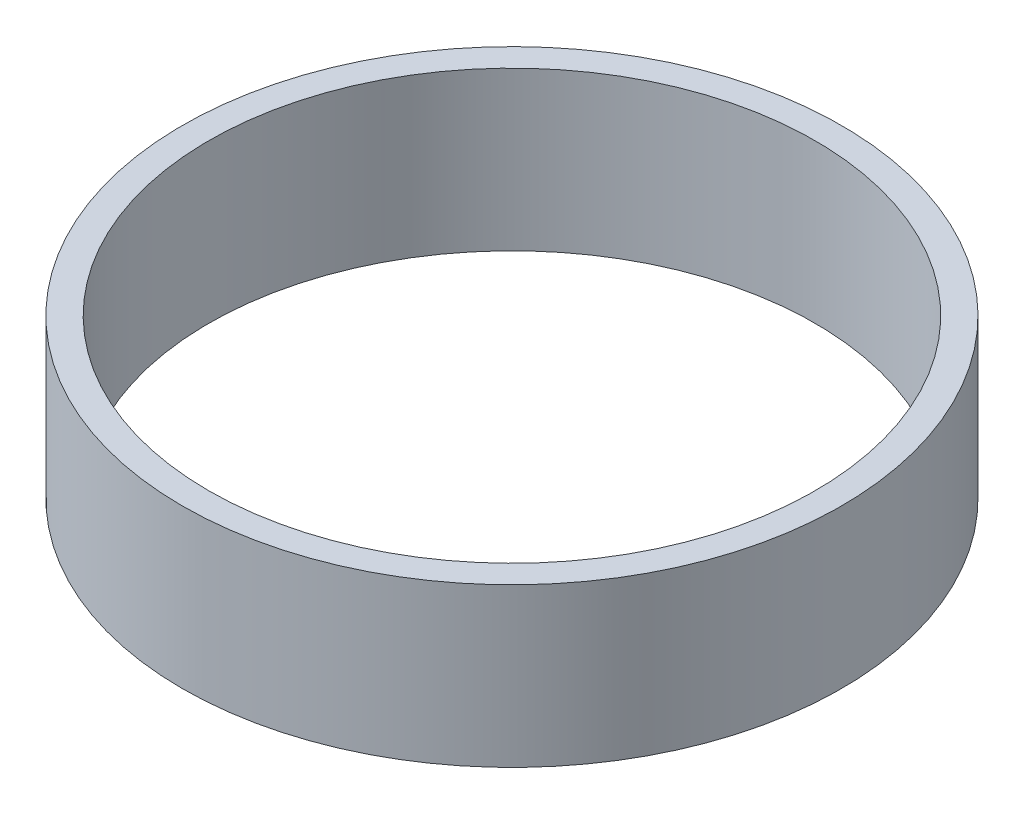
ISO-10303-21;
HEADER;
FILE_DESCRIPTION(('STEP AP214'),'2;1');
FILE_NAME('part.step','',(''),(''),'','','');
FILE_SCHEMA(('AUTOMOTIVE_DESIGN { 1 0 10303 214 1 1 1 1 }'));
ENDSEC;
DATA;
#1=APPLICATION_CONTEXT('core data for automotive mechanical design processes');
#2=APPLICATION_PROTOCOL_DEFINITION('international standard','automotive_design',2000,#1);
#3=PRODUCT_CONTEXT('',#1,'mechanical');
#4=PRODUCT('Part','Part','',(#3));
#5=PRODUCT_RELATED_PRODUCT_CATEGORY('part','',(#4));
#6=PRODUCT_DEFINITION_FORMATION('','',#4);
#7=PRODUCT_DEFINITION_CONTEXT('part definition',#1,'design');
#8=PRODUCT_DEFINITION('design','',#6,#7);
#9=PRODUCT_DEFINITION_SHAPE('','',#8);
#10=(LENGTH_UNIT() NAMED_UNIT(*) SI_UNIT(.MILLI.,.METRE.));
#11=(NAMED_UNIT(*) PLANE_ANGLE_UNIT() SI_UNIT($,.RADIAN.));
#12=(NAMED_UNIT(*) SI_UNIT($,.STERADIAN.) SOLID_ANGLE_UNIT());
#13=UNCERTAINTY_MEASURE_WITH_UNIT(LENGTH_MEASURE(1.E-05),#10,'distance_accuracy_value','');
#14=(GEOMETRIC_REPRESENTATION_CONTEXT(3) GLOBAL_UNCERTAINTY_ASSIGNED_CONTEXT((#13)) GLOBAL_UNIT_ASSIGNED_CONTEXT((#10,
#11,#12)) REPRESENTATION_CONTEXT('',''));
#15=CARTESIAN_POINT('',(0.,0.,0.));
#16=DIRECTION('',(0.,0.,1.));
#17=DIRECTION('',(1.,0.,0.));
#18=AXIS2_PLACEMENT_3D('',#15,#16,#17);
#19=CARTESIAN_POINT('',(0.,3.,0.));
#20=DIRECTION('',(0.,1.,0.));
#21=DIRECTION('',(0.,0.,1.));
#22=AXIS2_PLACEMENT_3D('',#19,#20,#21);
#23=PLANE('',#22);
#24=CARTESIAN_POINT('',(0.,3.,0.));
#25=DIRECTION('',(0.,1.,0.));
#26=DIRECTION('',(0.,0.,1.));
#27=AXIS2_PLACEMENT_3D('',#24,#25,#26);
#28=CIRCLE('',#27,6.25);
#29=CARTESIAN_POINT('',(0.,3.,6.25));
#30=VERTEX_POINT('',#29);
#31=EDGE_CURVE('E10',#30,#30,#28,.T.);
#32=ORIENTED_EDGE('',*,*,#31,.T.);
#33=EDGE_LOOP('',(#32));
#34=FACE_BOUND('',#33,.T.);
#35=CARTESIAN_POINT('',(0.,3.,0.));
#36=DIRECTION('',(0.,1.,0.));
#37=DIRECTION('',(0.,0.,1.));
#38=AXIS2_PLACEMENT_3D('',#35,#36,#37);
#39=CIRCLE('',#38,5.75);
#40=CARTESIAN_POINT('',(0.,3.,5.75));
#41=VERTEX_POINT('',#40);
#42=EDGE_CURVE('E52',#41,#41,#39,.T.);
#43=ORIENTED_EDGE('',*,*,#42,.F.);
#44=EDGE_LOOP('',(#43));
#45=FACE_BOUND('',#44,.T.);
#46=ADVANCED_FACE('F39',(#34,#45),#23,.T.);
#47=CARTESIAN_POINT('',(0.,0.,0.));
#48=DIRECTION('',(0.,1.,0.));
#49=DIRECTION('',(0.,0.,1.));
#50=AXIS2_PLACEMENT_3D('',#47,#48,#49);
#51=PLANE('',#50);
#52=CARTESIAN_POINT('',(0.,0.,0.));
#53=DIRECTION('',(0.,1.,0.));
#54=DIRECTION('',(0.,0.,1.));
#55=AXIS2_PLACEMENT_3D('',#52,#53,#54);
#56=CIRCLE('',#55,6.25);
#57=CARTESIAN_POINT('',(0.,0.,6.25));
#58=VERTEX_POINT('',#57);
#59=EDGE_CURVE('E43',#58,#58,#56,.T.);
#60=ORIENTED_EDGE('',*,*,#59,.F.);
#61=EDGE_LOOP('',(#60));
#62=FACE_BOUND('',#61,.T.);
#63=CARTESIAN_POINT('',(0.,0.,0.));
#64=DIRECTION('',(0.,1.,0.));
#65=DIRECTION('',(0.,0.,1.));
#66=AXIS2_PLACEMENT_3D('',#63,#64,#65);
#67=CIRCLE('',#66,5.75);
#68=CARTESIAN_POINT('',(0.,0.,5.75));
#69=VERTEX_POINT('',#68);
#70=EDGE_CURVE('E54',#69,#69,#67,.T.);
#71=ORIENTED_EDGE('',*,*,#70,.T.);
#72=EDGE_LOOP('',(#71));
#73=FACE_BOUND('',#72,.T.);
#74=ADVANCED_FACE('F66',(#62,#73),#51,.F.);
#75=CARTESIAN_POINT('',(0.,3.,0.));
#76=DIRECTION('',(0.,-1.,0.));
#77=DIRECTION('',(0.,0.,-1.));
#78=AXIS2_PLACEMENT_3D('',#75,#76,#77);
#79=CYLINDRICAL_SURFACE('',#78,6.25);
#80=ORIENTED_EDGE('',*,*,#31,.F.);
#81=EDGE_LOOP('',(#80));
#82=FACE_BOUND('',#81,.T.);
#83=ORIENTED_EDGE('',*,*,#59,.T.);
#84=EDGE_LOOP('',(#83));
#85=FACE_BOUND('',#84,.T.);
#86=ADVANCED_FACE('F41',(#82,#85),#79,.T.);
#87=CARTESIAN_POINT('',(0.,3.,0.));
#88=DIRECTION('',(0.,-1.,0.));
#89=DIRECTION('',(0.,0.,-1.));
#90=AXIS2_PLACEMENT_3D('',#87,#88,#89);
#91=CYLINDRICAL_SURFACE('',#90,5.75);
#92=ORIENTED_EDGE('',*,*,#42,.T.);
#93=EDGE_LOOP('',(#92));
#94=FACE_BOUND('',#93,.T.);
#95=ORIENTED_EDGE('',*,*,#70,.F.);
#96=EDGE_LOOP('',(#95));
#97=FACE_BOUND('',#96,.T.);
#98=ADVANCED_FACE('F62',(#94,#97),#91,.F.);
#99=CLOSED_SHELL('',(#46,#74,#86,#98));
#100=MANIFOLD_SOLID_BREP('B2',#99);
#101=ADVANCED_BREP_SHAPE_REPRESENTATION('',(#18,#100),#14);
#102=SHAPE_DEFINITION_REPRESENTATION(#9,#101);
ENDSEC;
END-ISO-10303-21;
